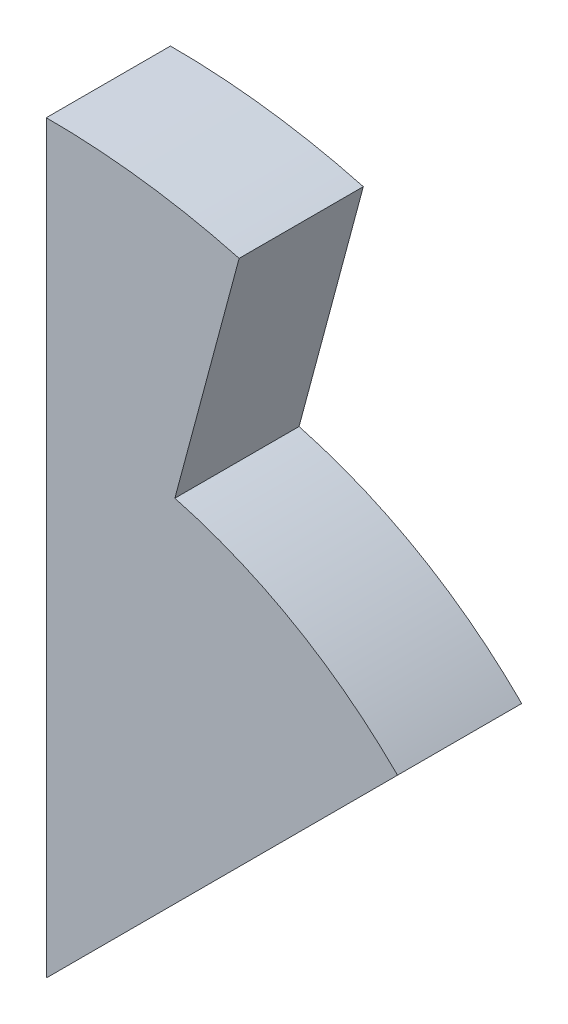
ISO-10303-21;
HEADER;
FILE_DESCRIPTION(('STEP AP214'),'2;1');
FILE_NAME('part.step','',(''),(''),'','','');
FILE_SCHEMA(('AUTOMOTIVE_DESIGN { 1 0 10303 214 1 1 1 1 }'));
ENDSEC;
DATA;
#1=APPLICATION_CONTEXT('core data for automotive mechanical design processes');
#2=APPLICATION_PROTOCOL_DEFINITION('international standard','automotive_design',2000,#1);
#3=PRODUCT_CONTEXT('',#1,'mechanical');
#4=PRODUCT('Part','Part','',(#3));
#5=PRODUCT_RELATED_PRODUCT_CATEGORY('part','',(#4));
#6=PRODUCT_DEFINITION_FORMATION('','',#4);
#7=PRODUCT_DEFINITION_CONTEXT('part definition',#1,'design');
#8=PRODUCT_DEFINITION('design','',#6,#7);
#9=PRODUCT_DEFINITION_SHAPE('','',#8);
#10=(LENGTH_UNIT() NAMED_UNIT(*) SI_UNIT(.MILLI.,.METRE.));
#11=(NAMED_UNIT(*) PLANE_ANGLE_UNIT() SI_UNIT($,.RADIAN.));
#12=(NAMED_UNIT(*) SI_UNIT($,.STERADIAN.) SOLID_ANGLE_UNIT());
#13=UNCERTAINTY_MEASURE_WITH_UNIT(LENGTH_MEASURE(1.E-05),#10,'distance_accuracy_value','');
#14=(GEOMETRIC_REPRESENTATION_CONTEXT(3) GLOBAL_UNCERTAINTY_ASSIGNED_CONTEXT((#13)) GLOBAL_UNIT_ASSIGNED_CONTEXT((#10,
#11,#12)) REPRESENTATION_CONTEXT('',''));
#15=CARTESIAN_POINT('',(0.,0.,0.));
#16=DIRECTION('',(0.,0.,1.));
#17=DIRECTION('',(1.,0.,0.));
#18=AXIS2_PLACEMENT_3D('',#15,#16,#17);
#19=CARTESIAN_POINT('',(0.,0.,5.));
#20=DIRECTION('',(-0.707106781186546,0.707106781186549,0.));
#21=DIRECTION('',(-0.707106781186549,-0.707106781186546,0.));
#22=AXIS2_PLACEMENT_3D('',#19,#20,#21);
#23=PLANE('',#22);
#24=DIRECTION('',(0.707106781186549,0.707106781186546,0.));
#25=VECTOR('',#24,1.);
#26=CARTESIAN_POINT('',(0.,0.,0.));
#27=LINE('',#26,#25);
#28=CARTESIAN_POINT('',(0.,0.,0.));
#29=VERTEX_POINT('',#28);
#30=CARTESIAN_POINT('',(14.142135623731,14.1421356237309,0.));
#31=VERTEX_POINT('',#30);
#32=EDGE_CURVE('E93',#29,#31,#27,.T.);
#33=ORIENTED_EDGE('',*,*,#32,.T.);
#34=DIRECTION('',(0.,0.,1.));
#35=VECTOR('',#34,1.);
#36=CARTESIAN_POINT('',(14.142135623731,14.1421356237309,0.));
#37=LINE('',#36,#35);
#38=CARTESIAN_POINT('',(14.142135623731,14.1421356237309,5.));
#39=VERTEX_POINT('',#38);
#40=EDGE_CURVE('E113',#31,#39,#37,.T.);
#41=ORIENTED_EDGE('',*,*,#40,.T.);
#42=DIRECTION('',(0.707106781186549,0.707106781186546,0.));
#43=VECTOR('',#42,1.);
#44=CARTESIAN_POINT('',(0.,0.,5.));
#45=LINE('',#44,#43);
#46=CARTESIAN_POINT('',(0.,0.,5.));
#47=VERTEX_POINT('',#46);
#48=EDGE_CURVE('E86',#47,#39,#45,.T.);
#49=ORIENTED_EDGE('',*,*,#48,.F.);
#50=DIRECTION('',(0.,0.,-1.));
#51=VECTOR('',#50,1.);
#52=CARTESIAN_POINT('',(0.,0.,5.));
#53=LINE('',#52,#51);
#54=EDGE_CURVE('E49',#47,#29,#53,.T.);
#55=ORIENTED_EDGE('',*,*,#54,.T.);
#56=EDGE_LOOP('',(#33,#41,#49,#55));
#57=FACE_BOUND('',#56,.T.);
#58=ADVANCED_FACE('F41',(#57),#23,.F.);
#59=CARTESIAN_POINT('',(0.,0.,5.));
#60=DIRECTION('',(0.,0.,-1.));
#61=DIRECTION('',(-1.,0.,0.));
#62=AXIS2_PLACEMENT_3D('',#59,#60,#61);
#63=CYLINDRICAL_SURFACE('',#62,30.);
#64=CARTESIAN_POINT('',(0.,0.,5.));
#65=DIRECTION('',(0.,0.,1.));
#66=DIRECTION('',(1.,0.,0.));
#67=AXIS2_PLACEMENT_3D('',#64,#65,#66);
#68=CIRCLE('',#67,30.);
#69=CARTESIAN_POINT('',(7.76457135307543,28.9777747886721,5.));
#70=VERTEX_POINT('',#69);
#71=CARTESIAN_POINT('',(0.,30.,5.));
#72=VERTEX_POINT('',#71);
#73=EDGE_CURVE('E108',#70,#72,#68,.T.);
#74=ORIENTED_EDGE('',*,*,#73,.F.);
#75=DIRECTION('',(0.,0.,1.));
#76=VECTOR('',#75,1.);
#77=CARTESIAN_POINT('',(7.76457135307543,28.9777747886721,0.));
#78=LINE('',#77,#76);
#79=CARTESIAN_POINT('',(7.76457135307543,28.9777747886721,0.));
#80=VERTEX_POINT('',#79);
#81=EDGE_CURVE('E103',#80,#70,#78,.T.);
#82=ORIENTED_EDGE('',*,*,#81,.F.);
#83=CARTESIAN_POINT('',(0.,0.,0.));
#84=DIRECTION('',(0.,0.,1.));
#85=DIRECTION('',(1.,0.,0.));
#86=AXIS2_PLACEMENT_3D('',#83,#84,#85);
#87=CIRCLE('',#86,30.);
#88=CARTESIAN_POINT('',(0.,30.,0.));
#89=VERTEX_POINT('',#88);
#90=EDGE_CURVE('E87',#80,#89,#87,.T.);
#91=ORIENTED_EDGE('',*,*,#90,.T.);
#92=DIRECTION('',(0.,0.,-1.));
#93=VECTOR('',#92,1.);
#94=CARTESIAN_POINT('',(0.,30.,5.));
#95=LINE('',#94,#93);
#96=EDGE_CURVE('E11',#72,#89,#95,.T.);
#97=ORIENTED_EDGE('',*,*,#96,.F.);
#98=EDGE_LOOP('',(#74,#82,#91,#97));
#99=FACE_BOUND('',#98,.T.);
#100=ADVANCED_FACE('F140',(#99),#63,.T.);
#101=CARTESIAN_POINT('',(0.,0.,5.));
#102=DIRECTION('',(1.,0.,0.));
#103=DIRECTION('',(0.,0.,-1.));
#104=AXIS2_PLACEMENT_3D('',#101,#102,#103);
#105=PLANE('',#104);
#106=DIRECTION('',(0.,-1.,0.));
#107=VECTOR('',#106,1.);
#108=CARTESIAN_POINT('',(0.,0.,0.));
#109=LINE('',#108,#107);
#110=EDGE_CURVE('E77',#89,#29,#109,.T.);
#111=ORIENTED_EDGE('',*,*,#110,.T.);
#112=ORIENTED_EDGE('',*,*,#54,.F.);
#113=DIRECTION('',(0.,-1.,0.));
#114=VECTOR('',#113,1.);
#115=CARTESIAN_POINT('',(0.,0.,5.));
#116=LINE('',#115,#114);
#117=EDGE_CURVE('E65',#72,#47,#116,.T.);
#118=ORIENTED_EDGE('',*,*,#117,.F.);
#119=ORIENTED_EDGE('',*,*,#96,.T.);
#120=EDGE_LOOP('',(#111,#112,#118,#119));
#121=FACE_BOUND('',#120,.T.);
#122=ADVANCED_FACE('F79',(#121),#105,.F.);
#123=CARTESIAN_POINT('',(0.,0.,5.));
#124=DIRECTION('',(0.,0.,1.));
#125=DIRECTION('',(1.,0.,0.));
#126=AXIS2_PLACEMENT_3D('',#123,#124,#125);
#127=PLANE('',#126);
#128=CARTESIAN_POINT('',(0.,0.,5.));
#129=DIRECTION('',(0.,0.,-1.));
#130=DIRECTION('',(1.,0.,0.));
#131=AXIS2_PLACEMENT_3D('',#128,#129,#130);
#132=CIRCLE('',#131,20.0000000000001);
#133=CARTESIAN_POINT('',(5.17638090205029,19.3185165257814,5.));
#134=VERTEX_POINT('',#133);
#135=EDGE_CURVE('E124',#134,#39,#132,.T.);
#136=ORIENTED_EDGE('',*,*,#135,.F.);
#137=DIRECTION('',(-0.258819045102514,-0.96592582628907,0.));
#138=VECTOR('',#137,1.);
#139=CARTESIAN_POINT('',(5.17638090205029,19.3185165257814,5.));
#140=LINE('',#139,#138);
#141=EDGE_CURVE('E120',#70,#134,#140,.T.);
#142=ORIENTED_EDGE('',*,*,#141,.F.);
#143=ORIENTED_EDGE('',*,*,#73,.T.);
#144=ORIENTED_EDGE('',*,*,#117,.T.);
#145=ORIENTED_EDGE('',*,*,#48,.T.);
#146=EDGE_LOOP('',(#136,#142,#143,#144,#145));
#147=FACE_BOUND('',#146,.T.);
#148=ADVANCED_FACE('F145',(#147),#127,.T.);
#149=CARTESIAN_POINT('',(0.,0.,0.));
#150=DIRECTION('',(0.,0.,1.));
#151=DIRECTION('',(1.,0.,0.));
#152=AXIS2_PLACEMENT_3D('',#149,#150,#151);
#153=PLANE('',#152);
#154=DIRECTION('',(-0.258819045102514,-0.96592582628907,0.));
#155=VECTOR('',#154,1.);
#156=CARTESIAN_POINT('',(5.17638090205029,19.3185165257814,0.));
#157=LINE('',#156,#155);
#158=CARTESIAN_POINT('',(5.17638090205029,19.3185165257814,0.));
#159=VERTEX_POINT('',#158);
#160=EDGE_CURVE('E116',#80,#159,#157,.T.);
#161=ORIENTED_EDGE('',*,*,#160,.T.);
#162=CARTESIAN_POINT('',(0.,0.,0.));
#163=DIRECTION('',(0.,0.,-1.));
#164=DIRECTION('',(1.,0.,0.));
#165=AXIS2_PLACEMENT_3D('',#162,#163,#164);
#166=CIRCLE('',#165,20.0000000000001);
#167=EDGE_CURVE('E56',#159,#31,#166,.T.);
#168=ORIENTED_EDGE('',*,*,#167,.T.);
#169=ORIENTED_EDGE('',*,*,#32,.F.);
#170=ORIENTED_EDGE('',*,*,#110,.F.);
#171=ORIENTED_EDGE('',*,*,#90,.F.);
#172=EDGE_LOOP('',(#161,#168,#169,#170,#171));
#173=FACE_BOUND('',#172,.T.);
#174=ADVANCED_FACE('F96',(#173),#153,.F.);
#175=CARTESIAN_POINT('',(0.,0.,0.));
#176=DIRECTION('',(0.,0.,1.));
#177=DIRECTION('',(1.,0.,0.));
#178=AXIS2_PLACEMENT_3D('',#175,#176,#177);
#179=CYLINDRICAL_SURFACE('',#178,20.0000000000001);
#180=ORIENTED_EDGE('',*,*,#135,.T.);
#181=ORIENTED_EDGE('',*,*,#40,.F.);
#182=ORIENTED_EDGE('',*,*,#167,.F.);
#183=DIRECTION('',(0.,0.,1.));
#184=VECTOR('',#183,1.);
#185=CARTESIAN_POINT('',(5.17638090205029,19.3185165257814,0.));
#186=LINE('',#185,#184);
#187=EDGE_CURVE('E98',#159,#134,#186,.T.);
#188=ORIENTED_EDGE('',*,*,#187,.T.);
#189=EDGE_LOOP('',(#180,#181,#182,#188));
#190=FACE_BOUND('',#189,.T.);
#191=ADVANCED_FACE('F148',(#190),#179,.T.);
#192=CARTESIAN_POINT('',(5.17638090205029,19.3185165257814,0.));
#193=DIRECTION('',(-0.96592582628907,0.258819045102514,0.));
#194=DIRECTION('',(-0.258819045102514,-0.96592582628907,0.));
#195=AXIS2_PLACEMENT_3D('',#192,#193,#194);
#196=PLANE('',#195);
#197=ORIENTED_EDGE('',*,*,#141,.T.);
#198=ORIENTED_EDGE('',*,*,#187,.F.);
#199=ORIENTED_EDGE('',*,*,#160,.F.);
#200=ORIENTED_EDGE('',*,*,#81,.T.);
#201=EDGE_LOOP('',(#197,#198,#199,#200));
#202=FACE_BOUND('',#201,.T.);
#203=ADVANCED_FACE('F134',(#202),#196,.F.);
#204=CLOSED_SHELL('',(#58,#100,#122,#148,#174,#191,#203));
#205=MANIFOLD_SOLID_BREP('B2',#204);
#206=ADVANCED_BREP_SHAPE_REPRESENTATION('',(#18,#205),#14);
#207=SHAPE_DEFINITION_REPRESENTATION(#9,#206);
ENDSEC;
END-ISO-10303-21;
